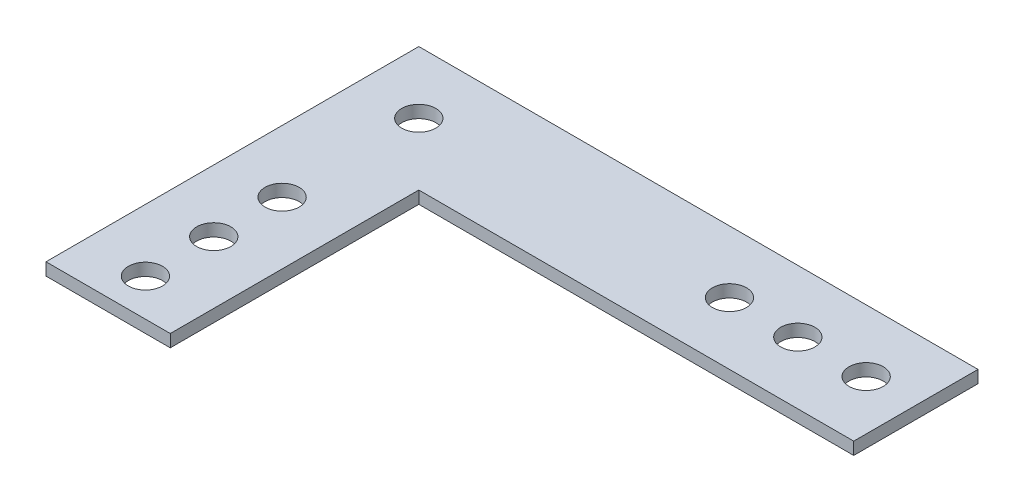
ISO-10303-21;
HEADER;
FILE_DESCRIPTION(('STEP AP214'),'2;1');
FILE_NAME('part.step','',(''),(''),'','','');
FILE_SCHEMA(('AUTOMOTIVE_DESIGN { 1 0 10303 214 1 1 1 1 }'));
ENDSEC;
DATA;
#1=APPLICATION_CONTEXT('core data for automotive mechanical design processes');
#2=APPLICATION_PROTOCOL_DEFINITION('international standard','automotive_design',2000,#1);
#3=PRODUCT_CONTEXT('',#1,'mechanical');
#4=PRODUCT('Part','Part','',(#3));
#5=PRODUCT_RELATED_PRODUCT_CATEGORY('part','',(#4));
#6=PRODUCT_DEFINITION_FORMATION('','',#4);
#7=PRODUCT_DEFINITION_CONTEXT('part definition',#1,'design');
#8=PRODUCT_DEFINITION('design','',#6,#7);
#9=PRODUCT_DEFINITION_SHAPE('','',#8);
#10=(LENGTH_UNIT() NAMED_UNIT(*) SI_UNIT(.MILLI.,.METRE.));
#11=(NAMED_UNIT(*) PLANE_ANGLE_UNIT() SI_UNIT($,.RADIAN.));
#12=(NAMED_UNIT(*) SI_UNIT($,.STERADIAN.) SOLID_ANGLE_UNIT());
#13=UNCERTAINTY_MEASURE_WITH_UNIT(LENGTH_MEASURE(1.E-05),#10,'distance_accuracy_value','');
#14=(GEOMETRIC_REPRESENTATION_CONTEXT(3) GLOBAL_UNCERTAINTY_ASSIGNED_CONTEXT((#13)) GLOBAL_UNIT_ASSIGNED_CONTEXT((#10,
#11,#12)) REPRESENTATION_CONTEXT('',''));
#15=CARTESIAN_POINT('',(0.,0.,0.));
#16=DIRECTION('',(0.,0.,1.));
#17=DIRECTION('',(1.,0.,0.));
#18=AXIS2_PLACEMENT_3D('',#15,#16,#17);
#19=CARTESIAN_POINT('',(0.,2.,0.));
#20=DIRECTION('',(0.,1.,0.));
#21=DIRECTION('',(0.,0.,1.));
#22=AXIS2_PLACEMENT_3D('',#19,#20,#21);
#23=PLANE('',#22);
#24=CARTESIAN_POINT('',(71.,2.,10.));
#25=DIRECTION('',(0.,1.,0.));
#26=DIRECTION('',(0.,0.,1.));
#27=AXIS2_PLACEMENT_3D('',#24,#25,#26);
#28=CIRCLE('',#27,2.75000000000001);
#29=CARTESIAN_POINT('',(71.,2.,12.75));
#30=VERTEX_POINT('',#29);
#31=EDGE_CURVE('E203',#30,#30,#28,.T.);
#32=ORIENTED_EDGE('',*,*,#31,.F.);
#33=EDGE_LOOP('',(#32));
#34=FACE_BOUND('',#33,.T.);
#35=CARTESIAN_POINT('',(10.,2.,32.));
#36=DIRECTION('',(0.,1.,0.));
#37=DIRECTION('',(0.,0.,1.));
#38=AXIS2_PLACEMENT_3D('',#35,#36,#37);
#39=CIRCLE('',#38,2.75);
#40=CARTESIAN_POINT('',(10.,2.,34.75));
#41=VERTEX_POINT('',#40);
#42=EDGE_CURVE('E215',#41,#41,#39,.T.);
#43=ORIENTED_EDGE('',*,*,#42,.F.);
#44=EDGE_LOOP('',(#43));
#45=FACE_BOUND('',#44,.T.);
#46=CARTESIAN_POINT('',(82.,2.,9.99999999999999));
#47=DIRECTION('',(0.,1.,0.));
#48=DIRECTION('',(0.,0.,1.));
#49=AXIS2_PLACEMENT_3D('',#46,#47,#48);
#50=CIRCLE('',#49,2.75000000000001);
#51=CARTESIAN_POINT('',(82.,2.,12.75));
#52=VERTEX_POINT('',#51);
#53=EDGE_CURVE('E227',#52,#52,#50,.T.);
#54=ORIENTED_EDGE('',*,*,#53,.F.);
#55=EDGE_LOOP('',(#54));
#56=FACE_BOUND('',#55,.T.);
#57=DIRECTION('',(0.,0.,1.));
#58=VECTOR('',#57,1.);
#59=CARTESIAN_POINT('',(0.,2.,0.));
#60=LINE('',#59,#58);
#61=CARTESIAN_POINT('',(0.,2.,0.));
#62=VERTEX_POINT('',#61);
#63=CARTESIAN_POINT('',(0.,2.,60.));
#64=VERTEX_POINT('',#63);
#65=EDGE_CURVE('E131',#62,#64,#60,.T.);
#66=ORIENTED_EDGE('',*,*,#65,.T.);
#67=DIRECTION('',(1.,0.,0.));
#68=VECTOR('',#67,1.);
#69=CARTESIAN_POINT('',(0.,2.,60.));
#70=LINE('',#69,#68);
#71=CARTESIAN_POINT('',(20.,2.,60.));
#72=VERTEX_POINT('',#71);
#73=EDGE_CURVE('E89',#64,#72,#70,.T.);
#74=ORIENTED_EDGE('',*,*,#73,.T.);
#75=DIRECTION('',(0.,0.,-1.));
#76=VECTOR('',#75,1.);
#77=CARTESIAN_POINT('',(20.,2.,60.));
#78=LINE('',#77,#76);
#79=CARTESIAN_POINT('',(20.,2.,20.));
#80=VERTEX_POINT('',#79);
#81=EDGE_CURVE('E102',#72,#80,#78,.T.);
#82=ORIENTED_EDGE('',*,*,#81,.T.);
#83=DIRECTION('',(1.,0.,0.));
#84=VECTOR('',#83,1.);
#85=CARTESIAN_POINT('',(90.,2.,20.));
#86=LINE('',#85,#84);
#87=CARTESIAN_POINT('',(90.,2.,20.));
#88=VERTEX_POINT('',#87);
#89=EDGE_CURVE('E96',#80,#88,#86,.T.);
#90=ORIENTED_EDGE('',*,*,#89,.T.);
#91=DIRECTION('',(0.,0.,-1.));
#92=VECTOR('',#91,1.);
#93=CARTESIAN_POINT('',(90.,2.,0.));
#94=LINE('',#93,#92);
#95=CARTESIAN_POINT('',(90.,2.,0.));
#96=VERTEX_POINT('',#95);
#97=EDGE_CURVE('E100',#88,#96,#94,.T.);
#98=ORIENTED_EDGE('',*,*,#97,.T.);
#99=DIRECTION('',(-1.,0.,0.));
#100=VECTOR('',#99,1.);
#101=CARTESIAN_POINT('',(0.,2.,0.));
#102=LINE('',#101,#100);
#103=EDGE_CURVE('E52',#96,#62,#102,.T.);
#104=ORIENTED_EDGE('',*,*,#103,.T.);
#105=EDGE_LOOP('',(#66,#74,#82,#90,#98,#104));
#106=FACE_BOUND('',#105,.T.);
#107=CARTESIAN_POINT('',(10.,2.,54.));
#108=DIRECTION('',(0.,1.,0.));
#109=DIRECTION('',(0.,0.,1.));
#110=AXIS2_PLACEMENT_3D('',#107,#108,#109);
#111=CIRCLE('',#110,2.75);
#112=CARTESIAN_POINT('',(10.,2.,56.75));
#113=VERTEX_POINT('',#112);
#114=EDGE_CURVE('E124',#113,#113,#111,.T.);
#115=ORIENTED_EDGE('',*,*,#114,.F.);
#116=EDGE_LOOP('',(#115));
#117=FACE_BOUND('',#116,.T.);
#118=CARTESIAN_POINT('',(10.,2.,43.));
#119=DIRECTION('',(0.,1.,0.));
#120=DIRECTION('',(0.,0.,1.));
#121=AXIS2_PLACEMENT_3D('',#118,#119,#120);
#122=CIRCLE('',#121,2.75);
#123=CARTESIAN_POINT('',(10.,2.,45.75));
#124=VERTEX_POINT('',#123);
#125=EDGE_CURVE('E221',#124,#124,#122,.T.);
#126=ORIENTED_EDGE('',*,*,#125,.F.);
#127=EDGE_LOOP('',(#126));
#128=FACE_BOUND('',#127,.T.);
#129=CARTESIAN_POINT('',(10.,2.,10.));
#130=DIRECTION('',(0.,1.,0.));
#131=DIRECTION('',(0.,0.,1.));
#132=AXIS2_PLACEMENT_3D('',#129,#130,#131);
#133=CIRCLE('',#132,2.75);
#134=CARTESIAN_POINT('',(10.,2.,12.75));
#135=VERTEX_POINT('',#134);
#136=EDGE_CURVE('E209',#135,#135,#133,.T.);
#137=ORIENTED_EDGE('',*,*,#136,.F.);
#138=EDGE_LOOP('',(#137));
#139=FACE_BOUND('',#138,.T.);
#140=CARTESIAN_POINT('',(60.,2.,10.));
#141=DIRECTION('',(0.,1.,0.));
#142=DIRECTION('',(0.,0.,1.));
#143=AXIS2_PLACEMENT_3D('',#140,#141,#142);
#144=CIRCLE('',#143,2.75000000000001);
#145=CARTESIAN_POINT('',(60.,2.,12.75));
#146=VERTEX_POINT('',#145);
#147=EDGE_CURVE('E194',#146,#146,#144,.T.);
#148=ORIENTED_EDGE('',*,*,#147,.F.);
#149=EDGE_LOOP('',(#148));
#150=FACE_BOUND('',#149,.T.);
#151=ADVANCED_FACE('F35',(#34,#45,#56,#106,#117,#128,#139,#150),#23,.T.);
#152=CARTESIAN_POINT('',(0.,0.,0.));
#153=DIRECTION('',(0.,1.,0.));
#154=DIRECTION('',(0.,0.,1.));
#155=AXIS2_PLACEMENT_3D('',#152,#153,#154);
#156=PLANE('',#155);
#157=DIRECTION('',(0.,0.,1.));
#158=VECTOR('',#157,1.);
#159=CARTESIAN_POINT('',(0.,0.,0.));
#160=LINE('',#159,#158);
#161=CARTESIAN_POINT('',(0.,0.,0.));
#162=VERTEX_POINT('',#161);
#163=CARTESIAN_POINT('',(0.,0.,60.));
#164=VERTEX_POINT('',#163);
#165=EDGE_CURVE('E120',#162,#164,#160,.T.);
#166=ORIENTED_EDGE('',*,*,#165,.F.);
#167=DIRECTION('',(-1.,0.,0.));
#168=VECTOR('',#167,1.);
#169=CARTESIAN_POINT('',(0.,0.,0.));
#170=LINE('',#169,#168);
#171=CARTESIAN_POINT('',(90.,0.,0.));
#172=VERTEX_POINT('',#171);
#173=EDGE_CURVE('E81',#172,#162,#170,.T.);
#174=ORIENTED_EDGE('',*,*,#173,.F.);
#175=DIRECTION('',(0.,0.,-1.));
#176=VECTOR('',#175,1.);
#177=CARTESIAN_POINT('',(90.,0.,0.));
#178=LINE('',#177,#176);
#179=CARTESIAN_POINT('',(90.,0.,20.));
#180=VERTEX_POINT('',#179);
#181=EDGE_CURVE('E75',#180,#172,#178,.T.);
#182=ORIENTED_EDGE('',*,*,#181,.F.);
#183=DIRECTION('',(1.,0.,0.));
#184=VECTOR('',#183,1.);
#185=CARTESIAN_POINT('',(90.,0.,20.));
#186=LINE('',#185,#184);
#187=CARTESIAN_POINT('',(20.,0.,20.));
#188=VERTEX_POINT('',#187);
#189=EDGE_CURVE('E110',#188,#180,#186,.T.);
#190=ORIENTED_EDGE('',*,*,#189,.F.);
#191=DIRECTION('',(0.,0.,-1.));
#192=VECTOR('',#191,1.);
#193=CARTESIAN_POINT('',(20.,0.,60.));
#194=LINE('',#193,#192);
#195=CARTESIAN_POINT('',(20.,0.,60.));
#196=VERTEX_POINT('',#195);
#197=EDGE_CURVE('E126',#196,#188,#194,.T.);
#198=ORIENTED_EDGE('',*,*,#197,.F.);
#199=DIRECTION('',(1.,0.,0.));
#200=VECTOR('',#199,1.);
#201=CARTESIAN_POINT('',(0.,0.,60.));
#202=LINE('',#201,#200);
#203=EDGE_CURVE('E123',#164,#196,#202,.T.);
#204=ORIENTED_EDGE('',*,*,#203,.F.);
#205=EDGE_LOOP('',(#166,#174,#182,#190,#198,#204));
#206=FACE_BOUND('',#205,.T.);
#207=CARTESIAN_POINT('',(10.,0.,54.));
#208=DIRECTION('',(0.,1.,0.));
#209=DIRECTION('',(0.,0.,1.));
#210=AXIS2_PLACEMENT_3D('',#207,#208,#209);
#211=CIRCLE('',#210,2.75);
#212=CARTESIAN_POINT('',(10.,0.,56.75));
#213=VERTEX_POINT('',#212);
#214=EDGE_CURVE('E230',#213,#213,#211,.T.);
#215=ORIENTED_EDGE('',*,*,#214,.T.);
#216=EDGE_LOOP('',(#215));
#217=FACE_BOUND('',#216,.T.);
#218=CARTESIAN_POINT('',(82.,0.,9.99999999999999));
#219=DIRECTION('',(0.,1.,0.));
#220=DIRECTION('',(0.,0.,1.));
#221=AXIS2_PLACEMENT_3D('',#218,#219,#220);
#222=CIRCLE('',#221,2.75000000000001);
#223=CARTESIAN_POINT('',(82.,0.,12.75));
#224=VERTEX_POINT('',#223);
#225=EDGE_CURVE('E224',#224,#224,#222,.T.);
#226=ORIENTED_EDGE('',*,*,#225,.T.);
#227=EDGE_LOOP('',(#226));
#228=FACE_BOUND('',#227,.T.);
#229=CARTESIAN_POINT('',(10.,0.,43.));
#230=DIRECTION('',(0.,1.,0.));
#231=DIRECTION('',(0.,0.,1.));
#232=AXIS2_PLACEMENT_3D('',#229,#230,#231);
#233=CIRCLE('',#232,2.75);
#234=CARTESIAN_POINT('',(10.,0.,45.75));
#235=VERTEX_POINT('',#234);
#236=EDGE_CURVE('E218',#235,#235,#233,.T.);
#237=ORIENTED_EDGE('',*,*,#236,.T.);
#238=EDGE_LOOP('',(#237));
#239=FACE_BOUND('',#238,.T.);
#240=CARTESIAN_POINT('',(10.,0.,32.));
#241=DIRECTION('',(0.,1.,0.));
#242=DIRECTION('',(0.,0.,1.));
#243=AXIS2_PLACEMENT_3D('',#240,#241,#242);
#244=CIRCLE('',#243,2.75);
#245=CARTESIAN_POINT('',(10.,0.,34.75));
#246=VERTEX_POINT('',#245);
#247=EDGE_CURVE('E212',#246,#246,#244,.T.);
#248=ORIENTED_EDGE('',*,*,#247,.T.);
#249=EDGE_LOOP('',(#248));
#250=FACE_BOUND('',#249,.T.);
#251=CARTESIAN_POINT('',(10.,0.,10.));
#252=DIRECTION('',(0.,1.,0.));
#253=DIRECTION('',(0.,0.,1.));
#254=AXIS2_PLACEMENT_3D('',#251,#252,#253);
#255=CIRCLE('',#254,2.75);
#256=CARTESIAN_POINT('',(10.,0.,12.75));
#257=VERTEX_POINT('',#256);
#258=EDGE_CURVE('E206',#257,#257,#255,.T.);
#259=ORIENTED_EDGE('',*,*,#258,.T.);
#260=EDGE_LOOP('',(#259));
#261=FACE_BOUND('',#260,.T.);
#262=CARTESIAN_POINT('',(71.,0.,10.));
#263=DIRECTION('',(0.,1.,0.));
#264=DIRECTION('',(0.,0.,1.));
#265=AXIS2_PLACEMENT_3D('',#262,#263,#264);
#266=CIRCLE('',#265,2.75000000000001);
#267=CARTESIAN_POINT('',(71.,0.,12.75));
#268=VERTEX_POINT('',#267);
#269=EDGE_CURVE('E200',#268,#268,#266,.T.);
#270=ORIENTED_EDGE('',*,*,#269,.T.);
#271=EDGE_LOOP('',(#270));
#272=FACE_BOUND('',#271,.T.);
#273=CARTESIAN_POINT('',(60.,0.,10.));
#274=DIRECTION('',(0.,1.,0.));
#275=DIRECTION('',(0.,0.,1.));
#276=AXIS2_PLACEMENT_3D('',#273,#274,#275);
#277=CIRCLE('',#276,2.75000000000001);
#278=CARTESIAN_POINT('',(60.,0.,12.75));
#279=VERTEX_POINT('',#278);
#280=EDGE_CURVE('E197',#279,#279,#277,.T.);
#281=ORIENTED_EDGE('',*,*,#280,.T.);
#282=EDGE_LOOP('',(#281));
#283=FACE_BOUND('',#282,.T.);
#284=ADVANCED_FACE('F140',(#206,#217,#228,#239,#250,#261,#272,#283),#156,.F.);
#285=CARTESIAN_POINT('',(0.,2.,0.));
#286=DIRECTION('',(1.,0.,0.));
#287=DIRECTION('',(0.,0.,-1.));
#288=AXIS2_PLACEMENT_3D('',#285,#286,#287);
#289=PLANE('',#288);
#290=ORIENTED_EDGE('',*,*,#165,.T.);
#291=DIRECTION('',(0.,-1.,0.));
#292=VECTOR('',#291,1.);
#293=CARTESIAN_POINT('',(0.,2.,60.));
#294=LINE('',#293,#292);
#295=EDGE_CURVE('E11',#64,#164,#294,.T.);
#296=ORIENTED_EDGE('',*,*,#295,.F.);
#297=ORIENTED_EDGE('',*,*,#65,.F.);
#298=DIRECTION('',(0.,-1.,0.));
#299=VECTOR('',#298,1.);
#300=CARTESIAN_POINT('',(0.,2.,0.));
#301=LINE('',#300,#299);
#302=EDGE_CURVE('E116',#62,#162,#301,.T.);
#303=ORIENTED_EDGE('',*,*,#302,.T.);
#304=EDGE_LOOP('',(#290,#296,#297,#303));
#305=FACE_BOUND('',#304,.T.);
#306=ADVANCED_FACE('F37',(#305),#289,.F.);
#307=CARTESIAN_POINT('',(0.,2.,60.));
#308=DIRECTION('',(0.,0.,-1.));
#309=DIRECTION('',(-1.,0.,0.));
#310=AXIS2_PLACEMENT_3D('',#307,#308,#309);
#311=PLANE('',#310);
#312=ORIENTED_EDGE('',*,*,#203,.T.);
#313=DIRECTION('',(0.,-1.,0.));
#314=VECTOR('',#313,1.);
#315=CARTESIAN_POINT('',(20.,2.,60.));
#316=LINE('',#315,#314);
#317=EDGE_CURVE('E44',#72,#196,#316,.T.);
#318=ORIENTED_EDGE('',*,*,#317,.F.);
#319=ORIENTED_EDGE('',*,*,#73,.F.);
#320=ORIENTED_EDGE('',*,*,#295,.T.);
#321=EDGE_LOOP('',(#312,#318,#319,#320));
#322=FACE_BOUND('',#321,.T.);
#323=ADVANCED_FACE('F315',(#322),#311,.F.);
#324=CARTESIAN_POINT('',(20.,2.,60.));
#325=DIRECTION('',(-1.,0.,0.));
#326=DIRECTION('',(0.,0.,1.));
#327=AXIS2_PLACEMENT_3D('',#324,#325,#326);
#328=PLANE('',#327);
#329=ORIENTED_EDGE('',*,*,#197,.T.);
#330=DIRECTION('',(0.,-1.,0.));
#331=VECTOR('',#330,1.);
#332=CARTESIAN_POINT('',(20.,2.,20.));
#333=LINE('',#332,#331);
#334=EDGE_CURVE('E111',#80,#188,#333,.T.);
#335=ORIENTED_EDGE('',*,*,#334,.F.);
#336=ORIENTED_EDGE('',*,*,#81,.F.);
#337=ORIENTED_EDGE('',*,*,#317,.T.);
#338=EDGE_LOOP('',(#329,#335,#336,#337));
#339=FACE_BOUND('',#338,.T.);
#340=ADVANCED_FACE('F137',(#339),#328,.F.);
#341=CARTESIAN_POINT('',(90.,2.,20.));
#342=DIRECTION('',(0.,0.,-1.));
#343=DIRECTION('',(-1.,0.,0.));
#344=AXIS2_PLACEMENT_3D('',#341,#342,#343);
#345=PLANE('',#344);
#346=ORIENTED_EDGE('',*,*,#189,.T.);
#347=DIRECTION('',(0.,-1.,0.));
#348=VECTOR('',#347,1.);
#349=CARTESIAN_POINT('',(90.,2.,20.));
#350=LINE('',#349,#348);
#351=EDGE_CURVE('E107',#88,#180,#350,.T.);
#352=ORIENTED_EDGE('',*,*,#351,.F.);
#353=ORIENTED_EDGE('',*,*,#89,.F.);
#354=ORIENTED_EDGE('',*,*,#334,.T.);
#355=EDGE_LOOP('',(#346,#352,#353,#354));
#356=FACE_BOUND('',#355,.T.);
#357=ADVANCED_FACE('F108',(#356),#345,.F.);
#358=CARTESIAN_POINT('',(90.,2.,0.));
#359=DIRECTION('',(-1.,0.,0.));
#360=DIRECTION('',(0.,0.,1.));
#361=AXIS2_PLACEMENT_3D('',#358,#359,#360);
#362=PLANE('',#361);
#363=ORIENTED_EDGE('',*,*,#181,.T.);
#364=DIRECTION('',(0.,-1.,0.));
#365=VECTOR('',#364,1.);
#366=CARTESIAN_POINT('',(90.,2.,0.));
#367=LINE('',#366,#365);
#368=EDGE_CURVE('E112',#96,#172,#367,.T.);
#369=ORIENTED_EDGE('',*,*,#368,.F.);
#370=ORIENTED_EDGE('',*,*,#97,.F.);
#371=ORIENTED_EDGE('',*,*,#351,.T.);
#372=EDGE_LOOP('',(#363,#369,#370,#371));
#373=FACE_BOUND('',#372,.T.);
#374=ADVANCED_FACE('F114',(#373),#362,.F.);
#375=CARTESIAN_POINT('',(0.,2.,0.));
#376=DIRECTION('',(0.,0.,1.));
#377=DIRECTION('',(1.,0.,0.));
#378=AXIS2_PLACEMENT_3D('',#375,#376,#377);
#379=PLANE('',#378);
#380=ORIENTED_EDGE('',*,*,#173,.T.);
#381=ORIENTED_EDGE('',*,*,#302,.F.);
#382=ORIENTED_EDGE('',*,*,#103,.F.);
#383=ORIENTED_EDGE('',*,*,#368,.T.);
#384=EDGE_LOOP('',(#380,#381,#382,#383));
#385=FACE_BOUND('',#384,.T.);
#386=ADVANCED_FACE('F145',(#385),#379,.F.);
#387=CARTESIAN_POINT('',(10.,2.,54.));
#388=DIRECTION('',(0.,-1.,0.));
#389=DIRECTION('',(0.,0.,-1.));
#390=AXIS2_PLACEMENT_3D('',#387,#388,#389);
#391=CYLINDRICAL_SURFACE('',#390,2.75);
#392=ORIENTED_EDGE('',*,*,#114,.T.);
#393=EDGE_LOOP('',(#392));
#394=FACE_BOUND('',#393,.T.);
#395=ORIENTED_EDGE('',*,*,#214,.F.);
#396=EDGE_LOOP('',(#395));
#397=FACE_BOUND('',#396,.T.);
#398=ADVANCED_FACE('F147',(#394,#397),#391,.F.);
#399=CARTESIAN_POINT('',(82.,2.,9.99999999999999));
#400=DIRECTION('',(0.,-1.,0.));
#401=DIRECTION('',(0.,0.,-1.));
#402=AXIS2_PLACEMENT_3D('',#399,#400,#401);
#403=CYLINDRICAL_SURFACE('',#402,2.75000000000001);
#404=ORIENTED_EDGE('',*,*,#53,.T.);
#405=EDGE_LOOP('',(#404));
#406=FACE_BOUND('',#405,.T.);
#407=ORIENTED_EDGE('',*,*,#225,.F.);
#408=EDGE_LOOP('',(#407));
#409=FACE_BOUND('',#408,.T.);
#410=ADVANCED_FACE('F153',(#406,#409),#403,.F.);
#411=CARTESIAN_POINT('',(10.,2.,43.));
#412=DIRECTION('',(0.,-1.,0.));
#413=DIRECTION('',(0.,0.,-1.));
#414=AXIS2_PLACEMENT_3D('',#411,#412,#413);
#415=CYLINDRICAL_SURFACE('',#414,2.75);
#416=ORIENTED_EDGE('',*,*,#125,.T.);
#417=EDGE_LOOP('',(#416));
#418=FACE_BOUND('',#417,.T.);
#419=ORIENTED_EDGE('',*,*,#236,.F.);
#420=EDGE_LOOP('',(#419));
#421=FACE_BOUND('',#420,.T.);
#422=ADVANCED_FACE('F169',(#418,#421),#415,.F.);
#423=CARTESIAN_POINT('',(10.,2.,32.));
#424=DIRECTION('',(0.,-1.,0.));
#425=DIRECTION('',(0.,0.,-1.));
#426=AXIS2_PLACEMENT_3D('',#423,#424,#425);
#427=CYLINDRICAL_SURFACE('',#426,2.75);
#428=ORIENTED_EDGE('',*,*,#42,.T.);
#429=EDGE_LOOP('',(#428));
#430=FACE_BOUND('',#429,.T.);
#431=ORIENTED_EDGE('',*,*,#247,.F.);
#432=EDGE_LOOP('',(#431));
#433=FACE_BOUND('',#432,.T.);
#434=ADVANCED_FACE('F173',(#430,#433),#427,.F.);
#435=CARTESIAN_POINT('',(10.,2.,10.));
#436=DIRECTION('',(0.,-1.,0.));
#437=DIRECTION('',(0.,0.,-1.));
#438=AXIS2_PLACEMENT_3D('',#435,#436,#437);
#439=CYLINDRICAL_SURFACE('',#438,2.75);
#440=ORIENTED_EDGE('',*,*,#136,.T.);
#441=EDGE_LOOP('',(#440));
#442=FACE_BOUND('',#441,.T.);
#443=ORIENTED_EDGE('',*,*,#258,.F.);
#444=EDGE_LOOP('',(#443));
#445=FACE_BOUND('',#444,.T.);
#446=ADVANCED_FACE('F177',(#442,#445),#439,.F.);
#447=CARTESIAN_POINT('',(71.,2.,10.));
#448=DIRECTION('',(0.,-1.,0.));
#449=DIRECTION('',(0.,0.,-1.));
#450=AXIS2_PLACEMENT_3D('',#447,#448,#449);
#451=CYLINDRICAL_SURFACE('',#450,2.75000000000001);
#452=ORIENTED_EDGE('',*,*,#31,.T.);
#453=EDGE_LOOP('',(#452));
#454=FACE_BOUND('',#453,.T.);
#455=ORIENTED_EDGE('',*,*,#269,.F.);
#456=EDGE_LOOP('',(#455));
#457=FACE_BOUND('',#456,.T.);
#458=ADVANCED_FACE('F181',(#454,#457),#451,.F.);
#459=CARTESIAN_POINT('',(60.,2.,10.));
#460=DIRECTION('',(0.,-1.,0.));
#461=DIRECTION('',(0.,0.,-1.));
#462=AXIS2_PLACEMENT_3D('',#459,#460,#461);
#463=CYLINDRICAL_SURFACE('',#462,2.75000000000001);
#464=ORIENTED_EDGE('',*,*,#147,.T.);
#465=EDGE_LOOP('',(#464));
#466=FACE_BOUND('',#465,.T.);
#467=ORIENTED_EDGE('',*,*,#280,.F.);
#468=EDGE_LOOP('',(#467));
#469=FACE_BOUND('',#468,.T.);
#470=ADVANCED_FACE('F185',(#466,#469),#463,.F.);
#471=CLOSED_SHELL('',(#151,#284,#306,#323,#340,#357,#374,#386,#398,#410,#422,#434,#446,#458,#470));
#472=MANIFOLD_SOLID_BREP('B2',#471);
#473=ADVANCED_BREP_SHAPE_REPRESENTATION('',(#18,#472),#14);
#474=SHAPE_DEFINITION_REPRESENTATION(#9,#473);
ENDSEC;
END-ISO-10303-21;
